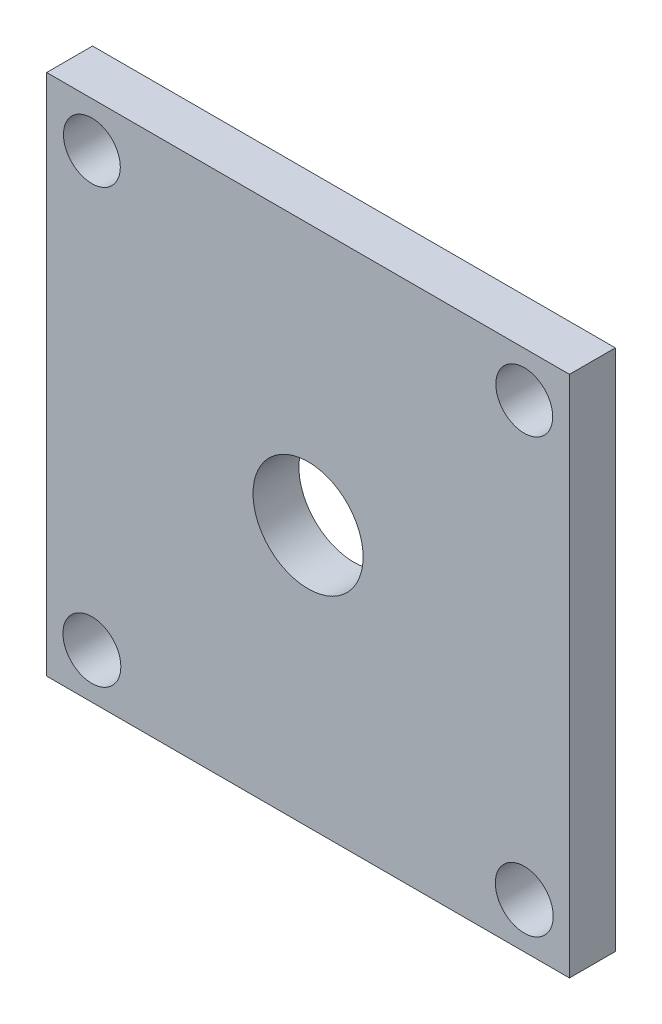
ISO-10303-21;
HEADER;
FILE_DESCRIPTION(('STEP AP214'),'2;1');
FILE_NAME('part.step','',(''),(''),'','','');
FILE_SCHEMA(('AUTOMOTIVE_DESIGN { 1 0 10303 214 1 1 1 1 }'));
ENDSEC;
DATA;
#1=APPLICATION_CONTEXT('core data for automotive mechanical design processes');
#2=APPLICATION_PROTOCOL_DEFINITION('international standard','automotive_design',2000,#1);
#3=PRODUCT_CONTEXT('',#1,'mechanical');
#4=PRODUCT('Part','Part','',(#3));
#5=PRODUCT_RELATED_PRODUCT_CATEGORY('part','',(#4));
#6=PRODUCT_DEFINITION_FORMATION('','',#4);
#7=PRODUCT_DEFINITION_CONTEXT('part definition',#1,'design');
#8=PRODUCT_DEFINITION('design','',#6,#7);
#9=PRODUCT_DEFINITION_SHAPE('','',#8);
#10=(LENGTH_UNIT() NAMED_UNIT(*) SI_UNIT(.MILLI.,.METRE.));
#11=(NAMED_UNIT(*) PLANE_ANGLE_UNIT() SI_UNIT($,.RADIAN.));
#12=(NAMED_UNIT(*) SI_UNIT($,.STERADIAN.) SOLID_ANGLE_UNIT());
#13=UNCERTAINTY_MEASURE_WITH_UNIT(LENGTH_MEASURE(1.E-05),#10,'distance_accuracy_value','');
#14=(GEOMETRIC_REPRESENTATION_CONTEXT(3) GLOBAL_UNCERTAINTY_ASSIGNED_CONTEXT((#13)) GLOBAL_UNIT_ASSIGNED_CONTEXT((#10,
#11,#12)) REPRESENTATION_CONTEXT('',''));
#15=CARTESIAN_POINT('',(0.,0.,0.));
#16=DIRECTION('',(0.,0.,1.));
#17=DIRECTION('',(1.,0.,0.));
#18=AXIS2_PLACEMENT_3D('',#15,#16,#17);
#19=CARTESIAN_POINT('',(0.,0.,5.));
#20=DIRECTION('',(0.,0.,1.));
#21=DIRECTION('',(1.,0.,0.));
#22=AXIS2_PLACEMENT_3D('',#19,#20,#21);
#23=PLANE('',#22);
#24=CARTESIAN_POINT('',(23.57,23.57,5.));
#25=DIRECTION('',(0.,0.,1.));
#26=DIRECTION('',(-1.,0.,0.));
#27=AXIS2_PLACEMENT_3D('',#24,#25,#26);
#28=CIRCLE('',#27,3.09902734317906);
#29=CARTESIAN_POINT('',(20.4709726568209,23.57,5.));
#30=VERTEX_POINT('',#29);
#31=EDGE_CURVE('E168',#30,#30,#28,.T.);
#32=ORIENTED_EDGE('',*,*,#31,.F.);
#33=EDGE_LOOP('',(#32));
#34=FACE_BOUND('',#33,.T.);
#35=CARTESIAN_POINT('',(-23.57,-23.57,5.));
#36=DIRECTION('',(0.,0.,1.));
#37=DIRECTION('',(1.,0.,0.));
#38=AXIS2_PLACEMENT_3D('',#35,#36,#37);
#39=CIRCLE('',#38,3.15558342281473);
#40=CARTESIAN_POINT('',(-20.4144165771853,-23.57,5.));
#41=VERTEX_POINT('',#40);
#42=EDGE_CURVE('E180',#41,#41,#39,.T.);
#43=ORIENTED_EDGE('',*,*,#42,.F.);
#44=EDGE_LOOP('',(#43));
#45=FACE_BOUND('',#44,.T.);
#46=DIRECTION('',(0.,-1.,0.));
#47=VECTOR('',#46,1.);
#48=CARTESIAN_POINT('',(-28.5,-28.5,5.));
#49=LINE('',#48,#47);
#50=CARTESIAN_POINT('',(-28.5,28.5,5.));
#51=VERTEX_POINT('',#50);
#52=CARTESIAN_POINT('',(-28.5,-28.5,5.));
#53=VERTEX_POINT('',#52);
#54=EDGE_CURVE('E58',#51,#53,#49,.T.);
#55=ORIENTED_EDGE('',*,*,#54,.T.);
#56=DIRECTION('',(1.,0.,0.));
#57=VECTOR('',#56,1.);
#58=CARTESIAN_POINT('',(28.5,-28.5,5.));
#59=LINE('',#58,#57);
#60=CARTESIAN_POINT('',(28.5,-28.5,5.));
#61=VERTEX_POINT('',#60);
#62=EDGE_CURVE('E88',#53,#61,#59,.T.);
#63=ORIENTED_EDGE('',*,*,#62,.T.);
#64=DIRECTION('',(0.,1.,0.));
#65=VECTOR('',#64,1.);
#66=CARTESIAN_POINT('',(28.5,-28.5,5.));
#67=LINE('',#66,#65);
#68=CARTESIAN_POINT('',(28.5,28.5,5.));
#69=VERTEX_POINT('',#68);
#70=EDGE_CURVE('E92',#61,#69,#67,.T.);
#71=ORIENTED_EDGE('',*,*,#70,.T.);
#72=DIRECTION('',(-1.,0.,0.));
#73=VECTOR('',#72,1.);
#74=CARTESIAN_POINT('',(28.5,28.5,5.));
#75=LINE('',#74,#73);
#76=EDGE_CURVE('E100',#69,#51,#75,.T.);
#77=ORIENTED_EDGE('',*,*,#76,.T.);
#78=EDGE_LOOP('',(#55,#63,#71,#77));
#79=FACE_BOUND('',#78,.T.);
#80=CARTESIAN_POINT('',(0.,0.,5.));
#81=DIRECTION('',(0.,0.,1.));
#82=DIRECTION('',(1.,0.,0.));
#83=AXIS2_PLACEMENT_3D('',#80,#81,#82);
#84=CIRCLE('',#83,6.);
#85=CARTESIAN_POINT('',(6.,0.,5.));
#86=VERTEX_POINT('',#85);
#87=EDGE_CURVE('E107',#86,#86,#84,.T.);
#88=ORIENTED_EDGE('',*,*,#87,.F.);
#89=EDGE_LOOP('',(#88));
#90=FACE_BOUND('',#89,.T.);
#91=CARTESIAN_POINT('',(-23.57,23.57,5.));
#92=DIRECTION('',(0.,0.,1.));
#93=DIRECTION('',(1.,0.,0.));
#94=AXIS2_PLACEMENT_3D('',#91,#92,#93);
#95=CIRCLE('',#94,3.09902734317906);
#96=CARTESIAN_POINT('',(-20.4709726568209,23.57,5.));
#97=VERTEX_POINT('',#96);
#98=EDGE_CURVE('E174',#97,#97,#95,.T.);
#99=ORIENTED_EDGE('',*,*,#98,.F.);
#100=EDGE_LOOP('',(#99));
#101=FACE_BOUND('',#100,.T.);
#102=CARTESIAN_POINT('',(23.57,-23.57,5.));
#103=DIRECTION('',(0.,0.,1.));
#104=DIRECTION('',(-1.,0.,0.));
#105=AXIS2_PLACEMENT_3D('',#102,#103,#104);
#106=CIRCLE('',#105,3.15558342281473);
#107=CARTESIAN_POINT('',(20.4144165771853,-23.57,5.));
#108=VERTEX_POINT('',#107);
#109=EDGE_CURVE('E159',#108,#108,#106,.T.);
#110=ORIENTED_EDGE('',*,*,#109,.F.);
#111=EDGE_LOOP('',(#110));
#112=FACE_BOUND('',#111,.T.);
#113=ADVANCED_FACE('F41',(#34,#45,#79,#90,#101,#112),#23,.T.);
#114=CARTESIAN_POINT('',(0.,0.,0.));
#115=DIRECTION('',(0.,0.,1.));
#116=DIRECTION('',(1.,0.,0.));
#117=AXIS2_PLACEMENT_3D('',#114,#115,#116);
#118=PLANE('',#117);
#119=DIRECTION('',(1.,0.,0.));
#120=VECTOR('',#119,1.);
#121=CARTESIAN_POINT('',(28.5,-28.5,0.));
#122=LINE('',#121,#120);
#123=CARTESIAN_POINT('',(-28.5,-28.5,0.));
#124=VERTEX_POINT('',#123);
#125=CARTESIAN_POINT('',(28.5,-28.5,0.));
#126=VERTEX_POINT('',#125);
#127=EDGE_CURVE('E96',#124,#126,#122,.T.);
#128=ORIENTED_EDGE('',*,*,#127,.F.);
#129=DIRECTION('',(0.,-1.,0.));
#130=VECTOR('',#129,1.);
#131=CARTESIAN_POINT('',(-28.5,28.5,0.));
#132=LINE('',#131,#130);
#133=CARTESIAN_POINT('',(-28.5,28.5,0.));
#134=VERTEX_POINT('',#133);
#135=EDGE_CURVE('E110',#134,#124,#132,.T.);
#136=ORIENTED_EDGE('',*,*,#135,.F.);
#137=DIRECTION('',(-1.,0.,0.));
#138=VECTOR('',#137,1.);
#139=CARTESIAN_POINT('',(28.5,28.5,0.));
#140=LINE('',#139,#138);
#141=CARTESIAN_POINT('',(28.5,28.5,0.));
#142=VERTEX_POINT('',#141);
#143=EDGE_CURVE('E82',#142,#134,#140,.T.);
#144=ORIENTED_EDGE('',*,*,#143,.F.);
#145=DIRECTION('',(0.,1.,0.));
#146=VECTOR('',#145,1.);
#147=CARTESIAN_POINT('',(28.5,28.5,0.));
#148=LINE('',#147,#146);
#149=EDGE_CURVE('E75',#126,#142,#148,.T.);
#150=ORIENTED_EDGE('',*,*,#149,.F.);
#151=EDGE_LOOP('',(#128,#136,#144,#150));
#152=FACE_BOUND('',#151,.T.);
#153=CARTESIAN_POINT('',(0.,0.,0.));
#154=DIRECTION('',(0.,0.,1.));
#155=DIRECTION('',(1.,0.,0.));
#156=AXIS2_PLACEMENT_3D('',#153,#154,#155);
#157=CIRCLE('',#156,6.);
#158=CARTESIAN_POINT('',(6.,0.,0.));
#159=VERTEX_POINT('',#158);
#160=EDGE_CURVE('E183',#159,#159,#157,.T.);
#161=ORIENTED_EDGE('',*,*,#160,.T.);
#162=EDGE_LOOP('',(#161));
#163=FACE_BOUND('',#162,.T.);
#164=CARTESIAN_POINT('',(-23.57,-23.57,0.));
#165=DIRECTION('',(0.,0.,1.));
#166=DIRECTION('',(1.,0.,0.));
#167=AXIS2_PLACEMENT_3D('',#164,#165,#166);
#168=CIRCLE('',#167,3.15558342281473);
#169=CARTESIAN_POINT('',(-20.4144165771853,-23.57,0.));
#170=VERTEX_POINT('',#169);
#171=EDGE_CURVE('E177',#170,#170,#168,.T.);
#172=ORIENTED_EDGE('',*,*,#171,.T.);
#173=EDGE_LOOP('',(#172));
#174=FACE_BOUND('',#173,.T.);
#175=CARTESIAN_POINT('',(-23.57,23.57,0.));
#176=DIRECTION('',(0.,0.,1.));
#177=DIRECTION('',(1.,0.,0.));
#178=AXIS2_PLACEMENT_3D('',#175,#176,#177);
#179=CIRCLE('',#178,3.09902734317906);
#180=CARTESIAN_POINT('',(-20.4709726568209,23.57,0.));
#181=VERTEX_POINT('',#180);
#182=EDGE_CURVE('E171',#181,#181,#179,.T.);
#183=ORIENTED_EDGE('',*,*,#182,.T.);
#184=EDGE_LOOP('',(#183));
#185=FACE_BOUND('',#184,.T.);
#186=CARTESIAN_POINT('',(23.57,23.57,0.));
#187=DIRECTION('',(0.,0.,1.));
#188=DIRECTION('',(-1.,0.,0.));
#189=AXIS2_PLACEMENT_3D('',#186,#187,#188);
#190=CIRCLE('',#189,3.09902734317906);
#191=CARTESIAN_POINT('',(20.4709726568209,23.57,0.));
#192=VERTEX_POINT('',#191);
#193=EDGE_CURVE('E165',#192,#192,#190,.T.);
#194=ORIENTED_EDGE('',*,*,#193,.T.);
#195=EDGE_LOOP('',(#194));
#196=FACE_BOUND('',#195,.T.);
#197=CARTESIAN_POINT('',(23.57,-23.57,0.));
#198=DIRECTION('',(0.,0.,1.));
#199=DIRECTION('',(-1.,0.,0.));
#200=AXIS2_PLACEMENT_3D('',#197,#198,#199);
#201=CIRCLE('',#200,3.15558342281473);
#202=CARTESIAN_POINT('',(20.4144165771853,-23.57,0.));
#203=VERTEX_POINT('',#202);
#204=EDGE_CURVE('E162',#203,#203,#201,.T.);
#205=ORIENTED_EDGE('',*,*,#204,.T.);
#206=EDGE_LOOP('',(#205));
#207=FACE_BOUND('',#206,.T.);
#208=ADVANCED_FACE('F116',(#152,#163,#174,#185,#196,#207),#118,.F.);
#209=CARTESIAN_POINT('',(28.5,-28.5,5.));
#210=DIRECTION('',(0.,1.,0.));
#211=DIRECTION('',(0.,0.,1.));
#212=AXIS2_PLACEMENT_3D('',#209,#210,#211);
#213=PLANE('',#212);
#214=ORIENTED_EDGE('',*,*,#127,.T.);
#215=DIRECTION('',(0.,0.,-1.));
#216=VECTOR('',#215,1.);
#217=CARTESIAN_POINT('',(28.5,-28.5,5.));
#218=LINE('',#217,#216);
#219=EDGE_CURVE('E50',#61,#126,#218,.T.);
#220=ORIENTED_EDGE('',*,*,#219,.F.);
#221=ORIENTED_EDGE('',*,*,#62,.F.);
#222=DIRECTION('',(0.,0.,-1.));
#223=VECTOR('',#222,1.);
#224=CARTESIAN_POINT('',(-28.5,-28.5,5.));
#225=LINE('',#224,#223);
#226=EDGE_CURVE('E11',#53,#124,#225,.T.);
#227=ORIENTED_EDGE('',*,*,#226,.T.);
#228=EDGE_LOOP('',(#214,#220,#221,#227));
#229=FACE_BOUND('',#228,.T.);
#230=ADVANCED_FACE('F43',(#229),#213,.F.);
#231=CARTESIAN_POINT('',(28.5,28.5,5.));
#232=DIRECTION('',(-1.,0.,0.));
#233=DIRECTION('',(0.,0.,1.));
#234=AXIS2_PLACEMENT_3D('',#231,#232,#233);
#235=PLANE('',#234);
#236=ORIENTED_EDGE('',*,*,#149,.T.);
#237=DIRECTION('',(0.,0.,-1.));
#238=VECTOR('',#237,1.);
#239=CARTESIAN_POINT('',(28.5,28.5,5.));
#240=LINE('',#239,#238);
#241=EDGE_CURVE('E97',#69,#142,#240,.T.);
#242=ORIENTED_EDGE('',*,*,#241,.F.);
#243=ORIENTED_EDGE('',*,*,#70,.F.);
#244=ORIENTED_EDGE('',*,*,#219,.T.);
#245=EDGE_LOOP('',(#236,#242,#243,#244));
#246=FACE_BOUND('',#245,.T.);
#247=ADVANCED_FACE('F98',(#246),#235,.F.);
#248=CARTESIAN_POINT('',(28.5,28.5,5.));
#249=DIRECTION('',(0.,-1.,0.));
#250=DIRECTION('',(0.,0.,-1.));
#251=AXIS2_PLACEMENT_3D('',#248,#249,#250);
#252=PLANE('',#251);
#253=ORIENTED_EDGE('',*,*,#143,.T.);
#254=DIRECTION('',(0.,0.,-1.));
#255=VECTOR('',#254,1.);
#256=CARTESIAN_POINT('',(-28.5,28.5,5.));
#257=LINE('',#256,#255);
#258=EDGE_CURVE('E102',#51,#134,#257,.T.);
#259=ORIENTED_EDGE('',*,*,#258,.F.);
#260=ORIENTED_EDGE('',*,*,#76,.F.);
#261=ORIENTED_EDGE('',*,*,#241,.T.);
#262=EDGE_LOOP('',(#253,#259,#260,#261));
#263=FACE_BOUND('',#262,.T.);
#264=ADVANCED_FACE('F113',(#263),#252,.F.);
#265=CARTESIAN_POINT('',(-28.5,28.5,5.));
#266=DIRECTION('',(1.,0.,0.));
#267=DIRECTION('',(0.,0.,-1.));
#268=AXIS2_PLACEMENT_3D('',#265,#266,#267);
#269=PLANE('',#268);
#270=ORIENTED_EDGE('',*,*,#135,.T.);
#271=ORIENTED_EDGE('',*,*,#226,.F.);
#272=ORIENTED_EDGE('',*,*,#54,.F.);
#273=ORIENTED_EDGE('',*,*,#258,.T.);
#274=EDGE_LOOP('',(#270,#271,#272,#273));
#275=FACE_BOUND('',#274,.T.);
#276=ADVANCED_FACE('F118',(#275),#269,.F.);
#277=CARTESIAN_POINT('',(0.,0.,5.));
#278=DIRECTION('',(0.,0.,-1.));
#279=DIRECTION('',(-1.,0.,0.));
#280=AXIS2_PLACEMENT_3D('',#277,#278,#279);
#281=CYLINDRICAL_SURFACE('',#280,6.);
#282=ORIENTED_EDGE('',*,*,#87,.T.);
#283=EDGE_LOOP('',(#282));
#284=FACE_BOUND('',#283,.T.);
#285=ORIENTED_EDGE('',*,*,#160,.F.);
#286=EDGE_LOOP('',(#285));
#287=FACE_BOUND('',#286,.T.);
#288=ADVANCED_FACE('F120',(#284,#287),#281,.F.);
#289=CARTESIAN_POINT('',(-23.57,-23.57,5.));
#290=DIRECTION('',(0.,0.,-1.));
#291=DIRECTION('',(-1.,0.,0.));
#292=AXIS2_PLACEMENT_3D('',#289,#290,#291);
#293=CYLINDRICAL_SURFACE('',#292,3.15558342281473);
#294=ORIENTED_EDGE('',*,*,#42,.T.);
#295=EDGE_LOOP('',(#294));
#296=FACE_BOUND('',#295,.T.);
#297=ORIENTED_EDGE('',*,*,#171,.F.);
#298=EDGE_LOOP('',(#297));
#299=FACE_BOUND('',#298,.T.);
#300=ADVANCED_FACE('F126',(#296,#299),#293,.F.);
#301=CARTESIAN_POINT('',(-23.57,23.57,5.));
#302=DIRECTION('',(0.,0.,-1.));
#303=DIRECTION('',(-1.,0.,0.));
#304=AXIS2_PLACEMENT_3D('',#301,#302,#303);
#305=CYLINDRICAL_SURFACE('',#304,3.09902734317906);
#306=ORIENTED_EDGE('',*,*,#98,.T.);
#307=EDGE_LOOP('',(#306));
#308=FACE_BOUND('',#307,.T.);
#309=ORIENTED_EDGE('',*,*,#182,.F.);
#310=EDGE_LOOP('',(#309));
#311=FACE_BOUND('',#310,.T.);
#312=ADVANCED_FACE('F142',(#308,#311),#305,.F.);
#313=CARTESIAN_POINT('',(23.57,23.57,5.));
#314=DIRECTION('',(0.,0.,-1.));
#315=DIRECTION('',(-1.,0.,0.));
#316=AXIS2_PLACEMENT_3D('',#313,#314,#315);
#317=CYLINDRICAL_SURFACE('',#316,3.09902734317906);
#318=ORIENTED_EDGE('',*,*,#31,.T.);
#319=EDGE_LOOP('',(#318));
#320=FACE_BOUND('',#319,.T.);
#321=ORIENTED_EDGE('',*,*,#193,.F.);
#322=EDGE_LOOP('',(#321));
#323=FACE_BOUND('',#322,.T.);
#324=ADVANCED_FACE('F146',(#320,#323),#317,.F.);
#325=CARTESIAN_POINT('',(23.57,-23.57,5.));
#326=DIRECTION('',(0.,0.,-1.));
#327=DIRECTION('',(-1.,0.,0.));
#328=AXIS2_PLACEMENT_3D('',#325,#326,#327);
#329=CYLINDRICAL_SURFACE('',#328,3.15558342281473);
#330=ORIENTED_EDGE('',*,*,#109,.T.);
#331=EDGE_LOOP('',(#330));
#332=FACE_BOUND('',#331,.T.);
#333=ORIENTED_EDGE('',*,*,#204,.F.);
#334=EDGE_LOOP('',(#333));
#335=FACE_BOUND('',#334,.T.);
#336=ADVANCED_FACE('F150',(#332,#335),#329,.F.);
#337=CLOSED_SHELL('',(#113,#208,#230,#247,#264,#276,#288,#300,#312,#324,#336));
#338=MANIFOLD_SOLID_BREP('B2',#337);
#339=ADVANCED_BREP_SHAPE_REPRESENTATION('',(#18,#338),#14);
#340=SHAPE_DEFINITION_REPRESENTATION(#9,#339);
ENDSEC;
END-ISO-10303-21;
